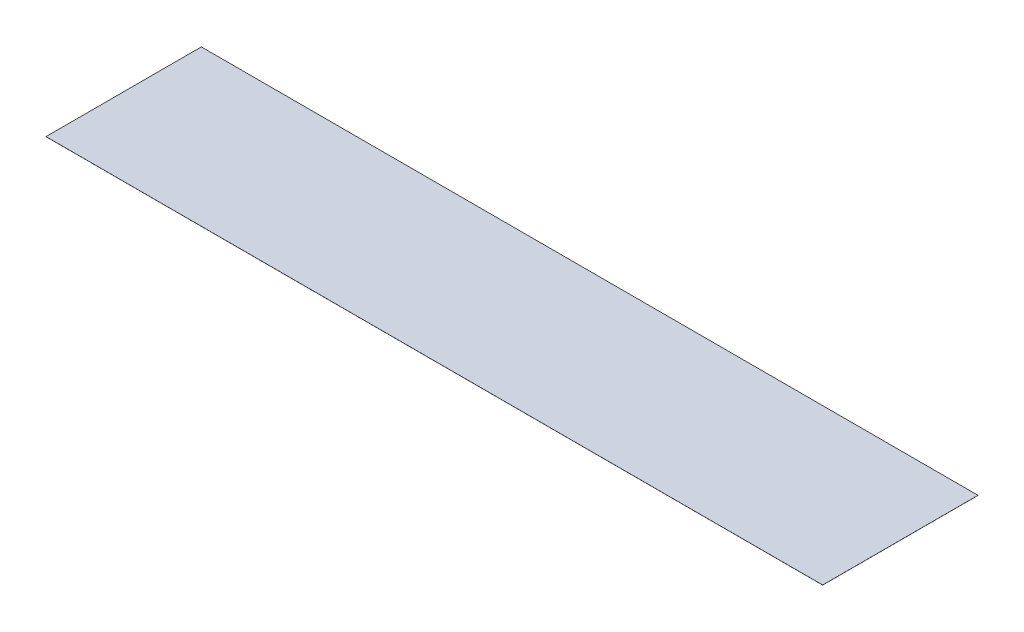
ISO-10303-21;
HEADER;
FILE_DESCRIPTION(('STEP AP214'),'2;1');
FILE_NAME('part.step','',(''),(''),'','','');
FILE_SCHEMA(('AUTOMOTIVE_DESIGN { 1 0 10303 214 1 1 1 1 }'));
ENDSEC;
DATA;
#1=APPLICATION_CONTEXT('core data for automotive mechanical design processes');
#2=APPLICATION_PROTOCOL_DEFINITION('international standard','automotive_design',2000,#1);
#3=PRODUCT_CONTEXT('',#1,'mechanical');
#4=PRODUCT('Part','Part','',(#3));
#5=PRODUCT_RELATED_PRODUCT_CATEGORY('part','',(#4));
#6=PRODUCT_DEFINITION_FORMATION('','',#4);
#7=PRODUCT_DEFINITION_CONTEXT('part definition',#1,'design');
#8=PRODUCT_DEFINITION('design','',#6,#7);
#9=PRODUCT_DEFINITION_SHAPE('','',#8);
#10=(LENGTH_UNIT() NAMED_UNIT(*) SI_UNIT(.MILLI.,.METRE.));
#11=(NAMED_UNIT(*) PLANE_ANGLE_UNIT() SI_UNIT($,.RADIAN.));
#12=(NAMED_UNIT(*) SI_UNIT($,.STERADIAN.) SOLID_ANGLE_UNIT());
#13=UNCERTAINTY_MEASURE_WITH_UNIT(LENGTH_MEASURE(1.E-05),#10,'distance_accuracy_value','');
#14=(GEOMETRIC_REPRESENTATION_CONTEXT(3) GLOBAL_UNCERTAINTY_ASSIGNED_CONTEXT((#13)) GLOBAL_UNIT_ASSIGNED_CONTEXT((#10,
#11,#12)) REPRESENTATION_CONTEXT('',''));
#15=CARTESIAN_POINT('',(0.,0.,0.));
#16=DIRECTION('',(0.,0.,1.));
#17=DIRECTION('',(1.,0.,0.));
#18=AXIS2_PLACEMENT_3D('',#15,#16,#17);
#19=CARTESIAN_POINT('',(750.,0.2,150.));
#20=DIRECTION('',(-1.,0.,0.));
#21=DIRECTION('',(0.,0.,1.));
#22=AXIS2_PLACEMENT_3D('',#19,#20,#21);
#23=PLANE('',#22);
#24=DIRECTION('',(0.,0.,-1.));
#25=VECTOR('',#24,1.);
#26=CARTESIAN_POINT('',(750.,0.,150.));
#27=LINE('',#26,#25);
#28=CARTESIAN_POINT('',(750.,0.,150.));
#29=VERTEX_POINT('',#28);
#30=CARTESIAN_POINT('',(750.,0.,-150.));
#31=VERTEX_POINT('',#30);
#32=EDGE_CURVE('E104',#29,#31,#27,.T.);
#33=ORIENTED_EDGE('',*,*,#32,.T.);
#34=DIRECTION('',(0.,-1.,0.));
#35=VECTOR('',#34,1.);
#36=CARTESIAN_POINT('',(750.,0.2,-150.));
#37=LINE('',#36,#35);
#38=CARTESIAN_POINT('',(750.,0.2,-150.));
#39=VERTEX_POINT('',#38);
#40=EDGE_CURVE('E11',#39,#31,#37,.T.);
#41=ORIENTED_EDGE('',*,*,#40,.F.);
#42=DIRECTION('',(0.,0.,-1.));
#43=VECTOR('',#42,1.);
#44=CARTESIAN_POINT('',(750.,0.2,150.));
#45=LINE('',#44,#43);
#46=CARTESIAN_POINT('',(750.,0.2,150.));
#47=VERTEX_POINT('',#46);
#48=EDGE_CURVE('E92',#47,#39,#45,.T.);
#49=ORIENTED_EDGE('',*,*,#48,.F.);
#50=DIRECTION('',(0.,-1.,0.));
#51=VECTOR('',#50,1.);
#52=CARTESIAN_POINT('',(750.,0.2,150.));
#53=LINE('',#52,#51);
#54=EDGE_CURVE('E100',#47,#29,#53,.T.);
#55=ORIENTED_EDGE('',*,*,#54,.T.);
#56=EDGE_LOOP('',(#33,#41,#49,#55));
#57=FACE_BOUND('',#56,.T.);
#58=ADVANCED_FACE('F41',(#57),#23,.F.);
#59=CARTESIAN_POINT('',(-750.,0.2,-150.));
#60=DIRECTION('',(0.,0.,1.));
#61=DIRECTION('',(1.,0.,0.));
#62=AXIS2_PLACEMENT_3D('',#59,#60,#61);
#63=PLANE('',#62);
#64=DIRECTION('',(-1.,0.,0.));
#65=VECTOR('',#64,1.);
#66=CARTESIAN_POINT('',(-750.,0.,-150.));
#67=LINE('',#66,#65);
#68=CARTESIAN_POINT('',(-750.,0.,-150.));
#69=VERTEX_POINT('',#68);
#70=EDGE_CURVE('E96',#31,#69,#67,.T.);
#71=ORIENTED_EDGE('',*,*,#70,.T.);
#72=DIRECTION('',(0.,-1.,0.));
#73=VECTOR('',#72,1.);
#74=CARTESIAN_POINT('',(-750.,0.2,-150.));
#75=LINE('',#74,#73);
#76=CARTESIAN_POINT('',(-750.,0.2,-150.));
#77=VERTEX_POINT('',#76);
#78=EDGE_CURVE('E49',#77,#69,#75,.T.);
#79=ORIENTED_EDGE('',*,*,#78,.F.);
#80=DIRECTION('',(-1.,0.,0.));
#81=VECTOR('',#80,1.);
#82=CARTESIAN_POINT('',(-750.,0.2,-150.));
#83=LINE('',#82,#81);
#84=EDGE_CURVE('E87',#39,#77,#83,.T.);
#85=ORIENTED_EDGE('',*,*,#84,.F.);
#86=ORIENTED_EDGE('',*,*,#40,.T.);
#87=EDGE_LOOP('',(#71,#79,#85,#86));
#88=FACE_BOUND('',#87,.T.);
#89=ADVANCED_FACE('F95',(#88),#63,.F.);
#90=CARTESIAN_POINT('',(-750.,0.2,150.));
#91=DIRECTION('',(1.,0.,0.));
#92=DIRECTION('',(0.,0.,-1.));
#93=AXIS2_PLACEMENT_3D('',#90,#91,#92);
#94=PLANE('',#93);
#95=DIRECTION('',(0.,0.,1.));
#96=VECTOR('',#95,1.);
#97=CARTESIAN_POINT('',(-750.,0.,150.));
#98=LINE('',#97,#96);
#99=CARTESIAN_POINT('',(-750.,0.,150.));
#100=VERTEX_POINT('',#99);
#101=EDGE_CURVE('E74',#69,#100,#98,.T.);
#102=ORIENTED_EDGE('',*,*,#101,.T.);
#103=DIRECTION('',(0.,-1.,0.));
#104=VECTOR('',#103,1.);
#105=CARTESIAN_POINT('',(-750.,0.2,150.));
#106=LINE('',#105,#104);
#107=CARTESIAN_POINT('',(-750.,0.2,150.));
#108=VERTEX_POINT('',#107);
#109=EDGE_CURVE('E97',#108,#100,#106,.T.);
#110=ORIENTED_EDGE('',*,*,#109,.F.);
#111=DIRECTION('',(0.,0.,1.));
#112=VECTOR('',#111,1.);
#113=CARTESIAN_POINT('',(-750.,0.2,150.));
#114=LINE('',#113,#112);
#115=EDGE_CURVE('E90',#77,#108,#114,.T.);
#116=ORIENTED_EDGE('',*,*,#115,.F.);
#117=ORIENTED_EDGE('',*,*,#78,.T.);
#118=EDGE_LOOP('',(#102,#110,#116,#117));
#119=FACE_BOUND('',#118,.T.);
#120=ADVANCED_FACE('F98',(#119),#94,.F.);
#121=CARTESIAN_POINT('',(-750.,0.2,150.));
#122=DIRECTION('',(0.,0.,-1.));
#123=DIRECTION('',(-1.,0.,0.));
#124=AXIS2_PLACEMENT_3D('',#121,#122,#123);
#125=PLANE('',#124);
#126=DIRECTION('',(1.,0.,0.));
#127=VECTOR('',#126,1.);
#128=CARTESIAN_POINT('',(-750.,0.,150.));
#129=LINE('',#128,#127);
#130=EDGE_CURVE('E80',#100,#29,#129,.T.);
#131=ORIENTED_EDGE('',*,*,#130,.T.);
#132=ORIENTED_EDGE('',*,*,#54,.F.);
#133=DIRECTION('',(1.,0.,0.));
#134=VECTOR('',#133,1.);
#135=CARTESIAN_POINT('',(-750.,0.2,150.));
#136=LINE('',#135,#134);
#137=EDGE_CURVE('E57',#108,#47,#136,.T.);
#138=ORIENTED_EDGE('',*,*,#137,.F.);
#139=ORIENTED_EDGE('',*,*,#109,.T.);
#140=EDGE_LOOP('',(#131,#132,#138,#139));
#141=FACE_BOUND('',#140,.T.);
#142=ADVANCED_FACE('F111',(#141),#125,.F.);
#143=CARTESIAN_POINT('',(0.,0.2,0.));
#144=DIRECTION('',(0.,-1.,0.));
#145=DIRECTION('',(0.,0.,-1.));
#146=AXIS2_PLACEMENT_3D('',#143,#144,#145);
#147=PLANE('',#146);
#148=ORIENTED_EDGE('',*,*,#48,.T.);
#149=ORIENTED_EDGE('',*,*,#84,.T.);
#150=ORIENTED_EDGE('',*,*,#115,.T.);
#151=ORIENTED_EDGE('',*,*,#137,.T.);
#152=EDGE_LOOP('',(#148,#149,#150,#151));
#153=FACE_BOUND('',#152,.T.);
#154=ADVANCED_FACE('F88',(#153),#147,.F.);
#155=CARTESIAN_POINT('',(0.,0.,0.));
#156=DIRECTION('',(0.,-1.,0.));
#157=DIRECTION('',(0.,0.,-1.));
#158=AXIS2_PLACEMENT_3D('',#155,#156,#157);
#159=PLANE('',#158);
#160=ORIENTED_EDGE('',*,*,#32,.F.);
#161=ORIENTED_EDGE('',*,*,#130,.F.);
#162=ORIENTED_EDGE('',*,*,#101,.F.);
#163=ORIENTED_EDGE('',*,*,#70,.F.);
#164=EDGE_LOOP('',(#160,#161,#162,#163));
#165=FACE_BOUND('',#164,.T.);
#166=ADVANCED_FACE('F114',(#165),#159,.T.);
#167=CLOSED_SHELL('',(#58,#89,#120,#142,#154,#166));
#168=MANIFOLD_SOLID_BREP('B2',#167);
#169=ADVANCED_BREP_SHAPE_REPRESENTATION('',(#18,#168),#14);
#170=SHAPE_DEFINITION_REPRESENTATION(#9,#169);
ENDSEC;
END-ISO-10303-21;
